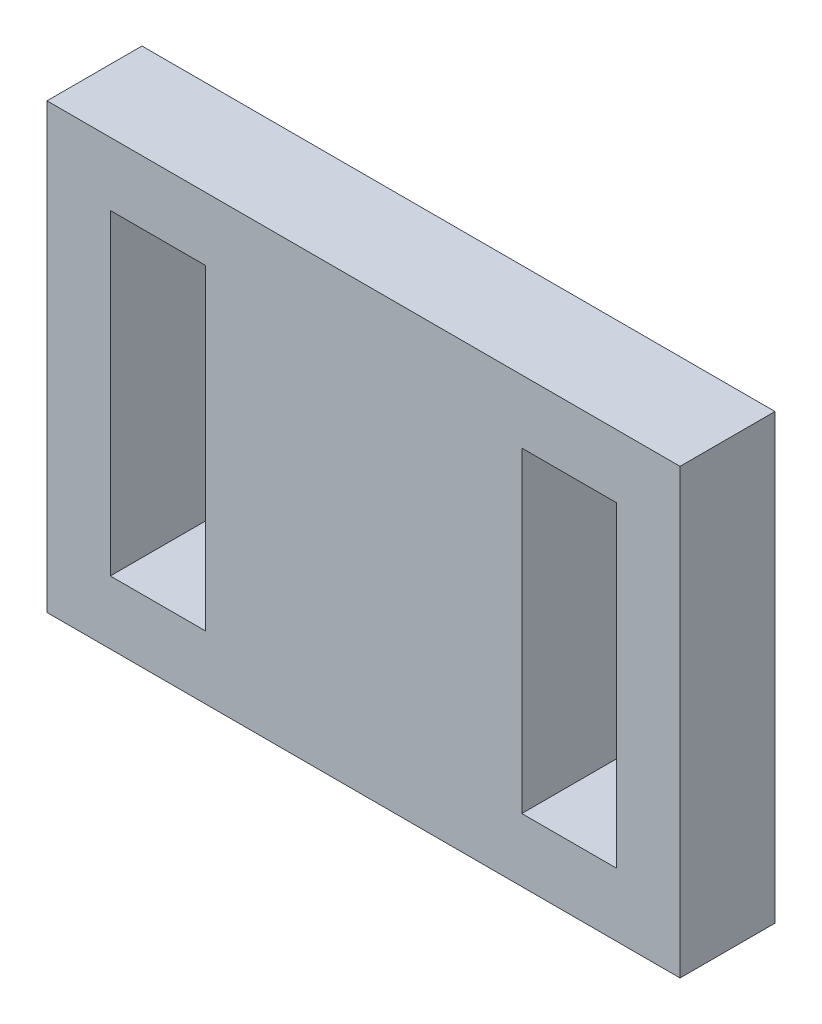
ISO-10303-21;
HEADER;
FILE_DESCRIPTION(('STEP AP214'),'2;1');
FILE_NAME('part.step','',(''),(''),'','','');
FILE_SCHEMA(('AUTOMOTIVE_DESIGN { 1 0 10303 214 1 1 1 1 }'));
ENDSEC;
DATA;
#1=APPLICATION_CONTEXT('core data for automotive mechanical design processes');
#2=APPLICATION_PROTOCOL_DEFINITION('international standard','automotive_design',2000,#1);
#3=PRODUCT_CONTEXT('',#1,'mechanical');
#4=PRODUCT('Part','Part','',(#3));
#5=PRODUCT_RELATED_PRODUCT_CATEGORY('part','',(#4));
#6=PRODUCT_DEFINITION_FORMATION('','',#4);
#7=PRODUCT_DEFINITION_CONTEXT('part definition',#1,'design');
#8=PRODUCT_DEFINITION('design','',#6,#7);
#9=PRODUCT_DEFINITION_SHAPE('','',#8);
#10=(LENGTH_UNIT() NAMED_UNIT(*) SI_UNIT(.MILLI.,.METRE.));
#11=(NAMED_UNIT(*) PLANE_ANGLE_UNIT() SI_UNIT($,.RADIAN.));
#12=(NAMED_UNIT(*) SI_UNIT($,.STERADIAN.) SOLID_ANGLE_UNIT());
#13=UNCERTAINTY_MEASURE_WITH_UNIT(LENGTH_MEASURE(1.E-05),#10,'distance_accuracy_value','');
#14=(GEOMETRIC_REPRESENTATION_CONTEXT(3) GLOBAL_UNCERTAINTY_ASSIGNED_CONTEXT((#13)) GLOBAL_UNIT_ASSIGNED_CONTEXT((#10,
#11,#12)) REPRESENTATION_CONTEXT('',''));
#15=CARTESIAN_POINT('',(0.,0.,0.));
#16=DIRECTION('',(0.,0.,1.));
#17=DIRECTION('',(1.,0.,0.));
#18=AXIS2_PLACEMENT_3D('',#15,#16,#17);
#19=CARTESIAN_POINT('',(0.,0.,3.));
#20=DIRECTION('',(0.,0.,1.));
#21=DIRECTION('',(1.,0.,0.));
#22=AXIS2_PLACEMENT_3D('',#19,#20,#21);
#23=PLANE('',#22);
#24=DIRECTION('',(0.,1.,0.));
#25=VECTOR('',#24,1.);
#26=CARTESIAN_POINT('',(10.,7.,3.));
#27=LINE('',#26,#25);
#28=CARTESIAN_POINT('',(10.,-7.,3.));
#29=VERTEX_POINT('',#28);
#30=CARTESIAN_POINT('',(10.,7.,3.));
#31=VERTEX_POINT('',#30);
#32=EDGE_CURVE('E220',#29,#31,#27,.T.);
#33=ORIENTED_EDGE('',*,*,#32,.T.);
#34=DIRECTION('',(-1.,0.,0.));
#35=VECTOR('',#34,1.);
#36=CARTESIAN_POINT('',(-10.,7.,3.));
#37=LINE('',#36,#35);
#38=CARTESIAN_POINT('',(-10.,7.,3.));
#39=VERTEX_POINT('',#38);
#40=EDGE_CURVE('E224',#31,#39,#37,.T.);
#41=ORIENTED_EDGE('',*,*,#40,.T.);
#42=DIRECTION('',(0.,-1.,0.));
#43=VECTOR('',#42,1.);
#44=CARTESIAN_POINT('',(-10.,7.,3.));
#45=LINE('',#44,#43);
#46=CARTESIAN_POINT('',(-10.,-7.,3.));
#47=VERTEX_POINT('',#46);
#48=EDGE_CURVE('E228',#39,#47,#45,.T.);
#49=ORIENTED_EDGE('',*,*,#48,.T.);
#50=DIRECTION('',(1.,0.,0.));
#51=VECTOR('',#50,1.);
#52=CARTESIAN_POINT('',(-10.,-7.,3.));
#53=LINE('',#52,#51);
#54=EDGE_CURVE('E231',#47,#29,#53,.T.);
#55=ORIENTED_EDGE('',*,*,#54,.T.);
#56=EDGE_LOOP('',(#33,#41,#49,#55));
#57=FACE_BOUND('',#56,.T.);
#58=DIRECTION('',(-1.,0.,0.));
#59=VECTOR('',#58,1.);
#60=CARTESIAN_POINT('',(8.,5.,3.));
#61=LINE('',#60,#59);
#62=CARTESIAN_POINT('',(8.,5.,3.));
#63=VERTEX_POINT('',#62);
#64=CARTESIAN_POINT('',(5.,5.,3.));
#65=VERTEX_POINT('',#64);
#66=EDGE_CURVE('E180',#63,#65,#61,.T.);
#67=ORIENTED_EDGE('',*,*,#66,.F.);
#68=DIRECTION('',(0.,1.,0.));
#69=VECTOR('',#68,1.);
#70=CARTESIAN_POINT('',(8.,5.,3.));
#71=LINE('',#70,#69);
#72=CARTESIAN_POINT('',(8.,-5.,3.));
#73=VERTEX_POINT('',#72);
#74=EDGE_CURVE('E177',#73,#63,#71,.T.);
#75=ORIENTED_EDGE('',*,*,#74,.F.);
#76=DIRECTION('',(1.,0.,0.));
#77=VECTOR('',#76,1.);
#78=CARTESIAN_POINT('',(8.,-5.,3.));
#79=LINE('',#78,#77);
#80=CARTESIAN_POINT('',(5.,-5.,3.));
#81=VERTEX_POINT('',#80);
#82=EDGE_CURVE('E188',#81,#73,#79,.T.);
#83=ORIENTED_EDGE('',*,*,#82,.F.);
#84=DIRECTION('',(0.,-1.,0.));
#85=VECTOR('',#84,1.);
#86=CARTESIAN_POINT('',(5.,5.,3.));
#87=LINE('',#86,#85);
#88=EDGE_CURVE('E184',#65,#81,#87,.T.);
#89=ORIENTED_EDGE('',*,*,#88,.F.);
#90=EDGE_LOOP('',(#67,#75,#83,#89));
#91=FACE_BOUND('',#90,.T.);
#92=DIRECTION('',(1.,0.,0.));
#93=VECTOR('',#92,1.);
#94=CARTESIAN_POINT('',(-8.,-5.,3.));
#95=LINE('',#94,#93);
#96=CARTESIAN_POINT('',(-8.,-5.,3.));
#97=VERTEX_POINT('',#96);
#98=CARTESIAN_POINT('',(-5.,-5.,3.));
#99=VERTEX_POINT('',#98);
#100=EDGE_CURVE('E138',#97,#99,#95,.T.);
#101=ORIENTED_EDGE('',*,*,#100,.F.);
#102=DIRECTION('',(0.,-1.,0.));
#103=VECTOR('',#102,1.);
#104=CARTESIAN_POINT('',(-8.,5.,3.));
#105=LINE('',#104,#103);
#106=CARTESIAN_POINT('',(-8.,5.,3.));
#107=VERTEX_POINT('',#106);
#108=EDGE_CURVE('E129',#107,#97,#105,.T.);
#109=ORIENTED_EDGE('',*,*,#108,.F.);
#110=DIRECTION('',(-1.,0.,0.));
#111=VECTOR('',#110,1.);
#112=CARTESIAN_POINT('',(-8.,5.,3.));
#113=LINE('',#112,#111);
#114=CARTESIAN_POINT('',(-5.,5.,3.));
#115=VERTEX_POINT('',#114);
#116=EDGE_CURVE('E155',#115,#107,#113,.T.);
#117=ORIENTED_EDGE('',*,*,#116,.F.);
#118=DIRECTION('',(0.,1.,0.));
#119=VECTOR('',#118,1.);
#120=CARTESIAN_POINT('',(-5.,5.,3.));
#121=LINE('',#120,#119);
#122=EDGE_CURVE('E151',#99,#115,#121,.T.);
#123=ORIENTED_EDGE('',*,*,#122,.F.);
#124=EDGE_LOOP('',(#101,#109,#117,#123));
#125=FACE_BOUND('',#124,.T.);
#126=ADVANCED_FACE('F39',(#57,#91,#125),#23,.T.);
#127=CARTESIAN_POINT('',(0.,0.,0.));
#128=DIRECTION('',(0.,0.,1.));
#129=DIRECTION('',(1.,0.,0.));
#130=AXIS2_PLACEMENT_3D('',#127,#128,#129);
#131=PLANE('',#130);
#132=DIRECTION('',(0.,1.,0.));
#133=VECTOR('',#132,1.);
#134=CARTESIAN_POINT('',(8.,5.,0.));
#135=LINE('',#134,#133);
#136=CARTESIAN_POINT('',(8.,-5.,0.));
#137=VERTEX_POINT('',#136);
#138=CARTESIAN_POINT('',(8.,5.,0.));
#139=VERTEX_POINT('',#138);
#140=EDGE_CURVE('E147',#137,#139,#135,.T.);
#141=ORIENTED_EDGE('',*,*,#140,.T.);
#142=DIRECTION('',(-1.,0.,0.));
#143=VECTOR('',#142,1.);
#144=CARTESIAN_POINT('',(8.,5.,0.));
#145=LINE('',#144,#143);
#146=CARTESIAN_POINT('',(5.,5.,0.));
#147=VERTEX_POINT('',#146);
#148=EDGE_CURVE('E195',#139,#147,#145,.T.);
#149=ORIENTED_EDGE('',*,*,#148,.T.);
#150=DIRECTION('',(0.,-1.,0.));
#151=VECTOR('',#150,1.);
#152=CARTESIAN_POINT('',(5.,5.,0.));
#153=LINE('',#152,#151);
#154=CARTESIAN_POINT('',(5.,-5.,0.));
#155=VERTEX_POINT('',#154);
#156=EDGE_CURVE('E199',#147,#155,#153,.T.);
#157=ORIENTED_EDGE('',*,*,#156,.T.);
#158=DIRECTION('',(1.,0.,0.));
#159=VECTOR('',#158,1.);
#160=CARTESIAN_POINT('',(8.,-5.,0.));
#161=LINE('',#160,#159);
#162=EDGE_CURVE('E181',#155,#137,#161,.T.);
#163=ORIENTED_EDGE('',*,*,#162,.T.);
#164=EDGE_LOOP('',(#141,#149,#157,#163));
#165=FACE_BOUND('',#164,.T.);
#166=DIRECTION('',(0.,1.,0.));
#167=VECTOR('',#166,1.);
#168=CARTESIAN_POINT('',(10.,7.,0.));
#169=LINE('',#168,#167);
#170=CARTESIAN_POINT('',(10.,-7.,0.));
#171=VERTEX_POINT('',#170);
#172=CARTESIAN_POINT('',(10.,7.,0.));
#173=VERTEX_POINT('',#172);
#174=EDGE_CURVE('E219',#171,#173,#169,.T.);
#175=ORIENTED_EDGE('',*,*,#174,.F.);
#176=DIRECTION('',(1.,0.,0.));
#177=VECTOR('',#176,1.);
#178=CARTESIAN_POINT('',(-10.,-7.,0.));
#179=LINE('',#178,#177);
#180=CARTESIAN_POINT('',(-10.,-7.,0.));
#181=VERTEX_POINT('',#180);
#182=EDGE_CURVE('E225',#181,#171,#179,.T.);
#183=ORIENTED_EDGE('',*,*,#182,.F.);
#184=DIRECTION('',(0.,-1.,0.));
#185=VECTOR('',#184,1.);
#186=CARTESIAN_POINT('',(-10.,7.,0.));
#187=LINE('',#186,#185);
#188=CARTESIAN_POINT('',(-10.,7.,0.));
#189=VERTEX_POINT('',#188);
#190=EDGE_CURVE('E241',#189,#181,#187,.T.);
#191=ORIENTED_EDGE('',*,*,#190,.F.);
#192=DIRECTION('',(-1.,0.,0.));
#193=VECTOR('',#192,1.);
#194=CARTESIAN_POINT('',(-10.,7.,0.));
#195=LINE('',#194,#193);
#196=EDGE_CURVE('E238',#173,#189,#195,.T.);
#197=ORIENTED_EDGE('',*,*,#196,.F.);
#198=EDGE_LOOP('',(#175,#183,#191,#197));
#199=FACE_BOUND('',#198,.T.);
#200=DIRECTION('',(0.,-1.,0.));
#201=VECTOR('',#200,1.);
#202=CARTESIAN_POINT('',(-8.,5.,0.));
#203=LINE('',#202,#201);
#204=CARTESIAN_POINT('',(-8.,5.,0.));
#205=VERTEX_POINT('',#204);
#206=CARTESIAN_POINT('',(-8.,-5.,0.));
#207=VERTEX_POINT('',#206);
#208=EDGE_CURVE('E63',#205,#207,#203,.T.);
#209=ORIENTED_EDGE('',*,*,#208,.T.);
#210=DIRECTION('',(1.,0.,0.));
#211=VECTOR('',#210,1.);
#212=CARTESIAN_POINT('',(-8.,-5.,0.));
#213=LINE('',#212,#211);
#214=CARTESIAN_POINT('',(-5.,-5.,0.));
#215=VERTEX_POINT('',#214);
#216=EDGE_CURVE('E145',#207,#215,#213,.T.);
#217=ORIENTED_EDGE('',*,*,#216,.T.);
#218=DIRECTION('',(0.,1.,0.));
#219=VECTOR('',#218,1.);
#220=CARTESIAN_POINT('',(-5.,5.,0.));
#221=LINE('',#220,#219);
#222=CARTESIAN_POINT('',(-5.,5.,0.));
#223=VERTEX_POINT('',#222);
#224=EDGE_CURVE('E164',#215,#223,#221,.T.);
#225=ORIENTED_EDGE('',*,*,#224,.T.);
#226=DIRECTION('',(-1.,0.,0.));
#227=VECTOR('',#226,1.);
#228=CARTESIAN_POINT('',(-8.,5.,0.));
#229=LINE('',#228,#227);
#230=EDGE_CURVE('E139',#223,#205,#229,.T.);
#231=ORIENTED_EDGE('',*,*,#230,.T.);
#232=EDGE_LOOP('',(#209,#217,#225,#231));
#233=FACE_BOUND('',#232,.T.);
#234=ADVANCED_FACE('F264',(#165,#199,#233),#131,.F.);
#235=CARTESIAN_POINT('',(10.,7.,3.));
#236=DIRECTION('',(-1.,0.,0.));
#237=DIRECTION('',(0.,0.,1.));
#238=AXIS2_PLACEMENT_3D('',#235,#236,#237);
#239=PLANE('',#238);
#240=ORIENTED_EDGE('',*,*,#174,.T.);
#241=DIRECTION('',(0.,0.,-1.));
#242=VECTOR('',#241,1.);
#243=CARTESIAN_POINT('',(10.,7.,3.));
#244=LINE('',#243,#242);
#245=EDGE_CURVE('E11',#31,#173,#244,.T.);
#246=ORIENTED_EDGE('',*,*,#245,.F.);
#247=ORIENTED_EDGE('',*,*,#32,.F.);
#248=DIRECTION('',(0.,0.,-1.));
#249=VECTOR('',#248,1.);
#250=CARTESIAN_POINT('',(10.,-7.,3.));
#251=LINE('',#250,#249);
#252=EDGE_CURVE('E234',#29,#171,#251,.T.);
#253=ORIENTED_EDGE('',*,*,#252,.T.);
#254=EDGE_LOOP('',(#240,#246,#247,#253));
#255=FACE_BOUND('',#254,.T.);
#256=ADVANCED_FACE('F41',(#255),#239,.F.);
#257=CARTESIAN_POINT('',(-10.,7.,3.));
#258=DIRECTION('',(0.,-1.,0.));
#259=DIRECTION('',(0.,0.,-1.));
#260=AXIS2_PLACEMENT_3D('',#257,#258,#259);
#261=PLANE('',#260);
#262=ORIENTED_EDGE('',*,*,#196,.T.);
#263=DIRECTION('',(0.,0.,-1.));
#264=VECTOR('',#263,1.);
#265=CARTESIAN_POINT('',(-10.,7.,3.));
#266=LINE('',#265,#264);
#267=EDGE_CURVE('E48',#39,#189,#266,.T.);
#268=ORIENTED_EDGE('',*,*,#267,.F.);
#269=ORIENTED_EDGE('',*,*,#40,.F.);
#270=ORIENTED_EDGE('',*,*,#245,.T.);
#271=EDGE_LOOP('',(#262,#268,#269,#270));
#272=FACE_BOUND('',#271,.T.);
#273=ADVANCED_FACE('F275',(#272),#261,.F.);
#274=CARTESIAN_POINT('',(-10.,7.,3.));
#275=DIRECTION('',(1.,0.,0.));
#276=DIRECTION('',(0.,1.,0.));
#277=AXIS2_PLACEMENT_3D('',#274,#275,#276);
#278=PLANE('',#277);
#279=ORIENTED_EDGE('',*,*,#190,.T.);
#280=DIRECTION('',(0.,0.,-1.));
#281=VECTOR('',#280,1.);
#282=CARTESIAN_POINT('',(-10.,-7.,3.));
#283=LINE('',#282,#281);
#284=EDGE_CURVE('E249',#47,#181,#283,.T.);
#285=ORIENTED_EDGE('',*,*,#284,.F.);
#286=ORIENTED_EDGE('',*,*,#48,.F.);
#287=ORIENTED_EDGE('',*,*,#267,.T.);
#288=EDGE_LOOP('',(#279,#285,#286,#287));
#289=FACE_BOUND('',#288,.T.);
#290=ADVANCED_FACE('F258',(#289),#278,.F.);
#291=CARTESIAN_POINT('',(-10.,-7.,3.));
#292=DIRECTION('',(0.,1.,0.));
#293=DIRECTION('',(-1.,0.,0.));
#294=AXIS2_PLACEMENT_3D('',#291,#292,#293);
#295=PLANE('',#294);
#296=ORIENTED_EDGE('',*,*,#182,.T.);
#297=ORIENTED_EDGE('',*,*,#252,.F.);
#298=ORIENTED_EDGE('',*,*,#54,.F.);
#299=ORIENTED_EDGE('',*,*,#284,.T.);
#300=EDGE_LOOP('',(#296,#297,#298,#299));
#301=FACE_BOUND('',#300,.T.);
#302=ADVANCED_FACE('F268',(#301),#295,.F.);
#303=CARTESIAN_POINT('',(8.,5.,3.));
#304=DIRECTION('',(-1.,0.,0.));
#305=DIRECTION('',(0.,-1.,0.));
#306=AXIS2_PLACEMENT_3D('',#303,#304,#305);
#307=PLANE('',#306);
#308=ORIENTED_EDGE('',*,*,#140,.F.);
#309=DIRECTION('',(0.,0.,-1.));
#310=VECTOR('',#309,1.);
#311=CARTESIAN_POINT('',(8.,-5.,3.));
#312=LINE('',#311,#310);
#313=EDGE_CURVE('E191',#73,#137,#312,.T.);
#314=ORIENTED_EDGE('',*,*,#313,.F.);
#315=ORIENTED_EDGE('',*,*,#74,.T.);
#316=DIRECTION('',(0.,0.,-1.));
#317=VECTOR('',#316,1.);
#318=CARTESIAN_POINT('',(8.,5.,3.));
#319=LINE('',#318,#317);
#320=EDGE_CURVE('E215',#63,#139,#319,.T.);
#321=ORIENTED_EDGE('',*,*,#320,.T.);
#322=EDGE_LOOP('',(#308,#314,#315,#321));
#323=FACE_BOUND('',#322,.T.);
#324=ADVANCED_FACE('F290',(#323),#307,.T.);
#325=CARTESIAN_POINT('',(8.,5.,3.));
#326=DIRECTION('',(0.,-1.,0.));
#327=DIRECTION('',(1.,0.,0.));
#328=AXIS2_PLACEMENT_3D('',#325,#326,#327);
#329=PLANE('',#328);
#330=ORIENTED_EDGE('',*,*,#148,.F.);
#331=ORIENTED_EDGE('',*,*,#320,.F.);
#332=ORIENTED_EDGE('',*,*,#66,.T.);
#333=DIRECTION('',(0.,0.,-1.));
#334=VECTOR('',#333,1.);
#335=CARTESIAN_POINT('',(5.,5.,3.));
#336=LINE('',#335,#334);
#337=EDGE_CURVE('E212',#65,#147,#336,.T.);
#338=ORIENTED_EDGE('',*,*,#337,.T.);
#339=EDGE_LOOP('',(#330,#331,#332,#338));
#340=FACE_BOUND('',#339,.T.);
#341=ADVANCED_FACE('F297',(#340),#329,.T.);
#342=CARTESIAN_POINT('',(5.,5.,3.));
#343=DIRECTION('',(1.,0.,0.));
#344=DIRECTION('',(0.,1.,0.));
#345=AXIS2_PLACEMENT_3D('',#342,#343,#344);
#346=PLANE('',#345);
#347=ORIENTED_EDGE('',*,*,#156,.F.);
#348=ORIENTED_EDGE('',*,*,#337,.F.);
#349=ORIENTED_EDGE('',*,*,#88,.T.);
#350=DIRECTION('',(0.,0.,-1.));
#351=VECTOR('',#350,1.);
#352=CARTESIAN_POINT('',(5.,-5.,3.));
#353=LINE('',#352,#351);
#354=EDGE_CURVE('E209',#81,#155,#353,.T.);
#355=ORIENTED_EDGE('',*,*,#354,.T.);
#356=EDGE_LOOP('',(#347,#348,#349,#355));
#357=FACE_BOUND('',#356,.T.);
#358=ADVANCED_FACE('F302',(#357),#346,.T.);
#359=CARTESIAN_POINT('',(8.,-5.,3.));
#360=DIRECTION('',(0.,1.,0.));
#361=DIRECTION('',(0.,0.,1.));
#362=AXIS2_PLACEMENT_3D('',#359,#360,#361);
#363=PLANE('',#362);
#364=ORIENTED_EDGE('',*,*,#162,.F.);
#365=ORIENTED_EDGE('',*,*,#354,.F.);
#366=ORIENTED_EDGE('',*,*,#82,.T.);
#367=ORIENTED_EDGE('',*,*,#313,.T.);
#368=EDGE_LOOP('',(#364,#365,#366,#367));
#369=FACE_BOUND('',#368,.T.);
#370=ADVANCED_FACE('F309',(#369),#363,.T.);
#371=CARTESIAN_POINT('',(-8.,5.,3.));
#372=DIRECTION('',(1.,0.,0.));
#373=DIRECTION('',(0.,1.,0.));
#374=AXIS2_PLACEMENT_3D('',#371,#372,#373);
#375=PLANE('',#374);
#376=ORIENTED_EDGE('',*,*,#208,.F.);
#377=DIRECTION('',(0.,0.,-1.));
#378=VECTOR('',#377,1.);
#379=CARTESIAN_POINT('',(-8.,5.,3.));
#380=LINE('',#379,#378);
#381=EDGE_CURVE('E133',#107,#205,#380,.T.);
#382=ORIENTED_EDGE('',*,*,#381,.F.);
#383=ORIENTED_EDGE('',*,*,#108,.T.);
#384=DIRECTION('',(0.,0.,-1.));
#385=VECTOR('',#384,1.);
#386=CARTESIAN_POINT('',(-8.,-5.,3.));
#387=LINE('',#386,#385);
#388=EDGE_CURVE('E132',#97,#207,#387,.T.);
#389=ORIENTED_EDGE('',*,*,#388,.T.);
#390=EDGE_LOOP('',(#376,#382,#383,#389));
#391=FACE_BOUND('',#390,.T.);
#392=ADVANCED_FACE('F131',(#391),#375,.T.);
#393=CARTESIAN_POINT('',(-8.,-5.,3.));
#394=DIRECTION('',(0.,1.,0.));
#395=DIRECTION('',(0.,0.,1.));
#396=AXIS2_PLACEMENT_3D('',#393,#394,#395);
#397=PLANE('',#396);
#398=ORIENTED_EDGE('',*,*,#216,.F.);
#399=ORIENTED_EDGE('',*,*,#388,.F.);
#400=ORIENTED_EDGE('',*,*,#100,.T.);
#401=DIRECTION('',(0.,0.,-1.));
#402=VECTOR('',#401,1.);
#403=CARTESIAN_POINT('',(-5.,-5.,3.));
#404=LINE('',#403,#402);
#405=EDGE_CURVE('E148',#99,#215,#404,.T.);
#406=ORIENTED_EDGE('',*,*,#405,.T.);
#407=EDGE_LOOP('',(#398,#399,#400,#406));
#408=FACE_BOUND('',#407,.T.);
#409=ADVANCED_FACE('F142',(#408),#397,.T.);
#410=CARTESIAN_POINT('',(-5.,5.,3.));
#411=DIRECTION('',(-1.,0.,0.));
#412=DIRECTION('',(0.,-1.,0.));
#413=AXIS2_PLACEMENT_3D('',#410,#411,#412);
#414=PLANE('',#413);
#415=ORIENTED_EDGE('',*,*,#224,.F.);
#416=ORIENTED_EDGE('',*,*,#405,.F.);
#417=ORIENTED_EDGE('',*,*,#122,.T.);
#418=DIRECTION('',(0.,0.,-1.));
#419=VECTOR('',#418,1.);
#420=CARTESIAN_POINT('',(-5.,5.,3.));
#421=LINE('',#420,#419);
#422=EDGE_CURVE('E55',#115,#223,#421,.T.);
#423=ORIENTED_EDGE('',*,*,#422,.T.);
#424=EDGE_LOOP('',(#415,#416,#417,#423));
#425=FACE_BOUND('',#424,.T.);
#426=ADVANCED_FACE('F327',(#425),#414,.T.);
#427=CARTESIAN_POINT('',(-8.,5.,3.));
#428=DIRECTION('',(0.,-1.,0.));
#429=DIRECTION('',(1.,0.,0.));
#430=AXIS2_PLACEMENT_3D('',#427,#428,#429);
#431=PLANE('',#430);
#432=ORIENTED_EDGE('',*,*,#230,.F.);
#433=ORIENTED_EDGE('',*,*,#422,.F.);
#434=ORIENTED_EDGE('',*,*,#116,.T.);
#435=ORIENTED_EDGE('',*,*,#381,.T.);
#436=EDGE_LOOP('',(#432,#433,#434,#435));
#437=FACE_BOUND('',#436,.T.);
#438=ADVANCED_FACE('F330',(#437),#431,.T.);
#439=CLOSED_SHELL('',(#126,#234,#256,#273,#290,#302,#324,#341,#358,#370,#392,#409,#426,#438));
#440=MANIFOLD_SOLID_BREP('B2',#439);
#441=ADVANCED_BREP_SHAPE_REPRESENTATION('',(#18,#440),#14);
#442=SHAPE_DEFINITION_REPRESENTATION(#9,#441);
ENDSEC;
END-ISO-10303-21;
